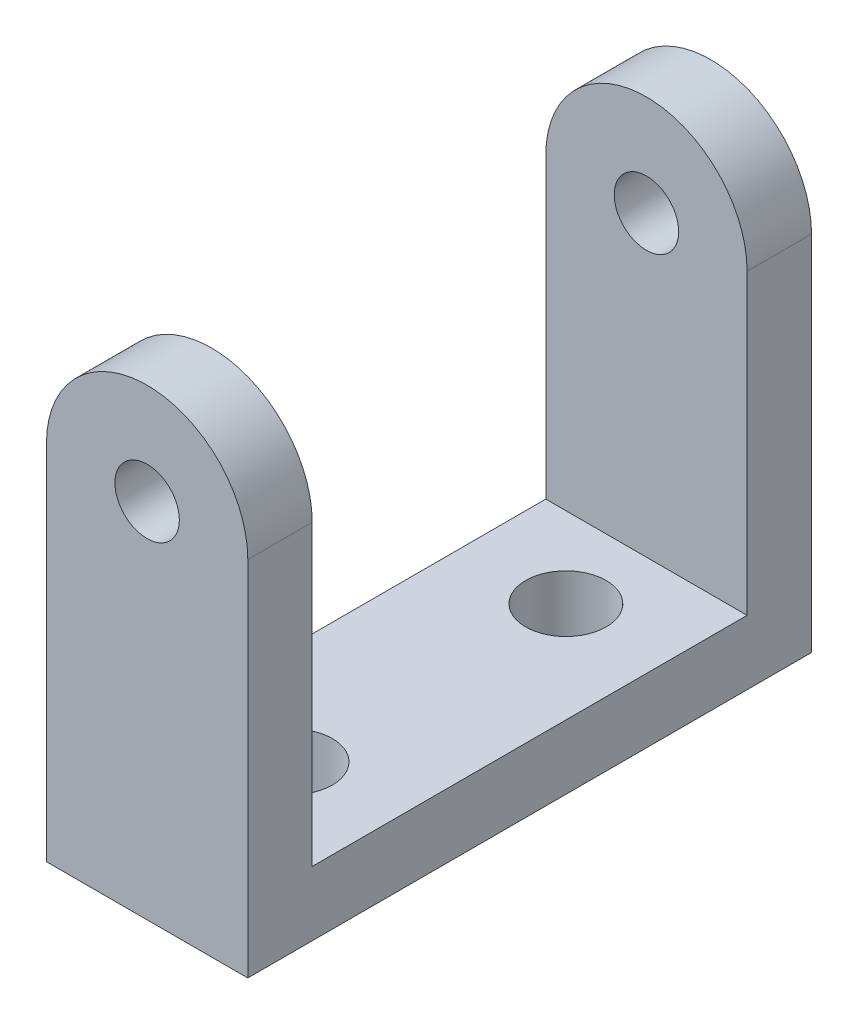
ISO-10303-21;
HEADER;
FILE_DESCRIPTION(('STEP AP214'),'2;1');
FILE_NAME('part.step','',(''),(''),'','','');
FILE_SCHEMA(('AUTOMOTIVE_DESIGN { 1 0 10303 214 1 1 1 1 }'));
ENDSEC;
DATA;
#1=APPLICATION_CONTEXT('core data for automotive mechanical design processes');
#2=APPLICATION_PROTOCOL_DEFINITION('international standard','automotive_design',2000,#1);
#3=PRODUCT_CONTEXT('',#1,'mechanical');
#4=PRODUCT('Part','Part','',(#3));
#5=PRODUCT_RELATED_PRODUCT_CATEGORY('part','',(#4));
#6=PRODUCT_DEFINITION_FORMATION('','',#4);
#7=PRODUCT_DEFINITION_CONTEXT('part definition',#1,'design');
#8=PRODUCT_DEFINITION('design','',#6,#7);
#9=PRODUCT_DEFINITION_SHAPE('','',#8);
#10=(LENGTH_UNIT() NAMED_UNIT(*) SI_UNIT(.MILLI.,.METRE.));
#11=(NAMED_UNIT(*) PLANE_ANGLE_UNIT() SI_UNIT($,.RADIAN.));
#12=(NAMED_UNIT(*) SI_UNIT($,.STERADIAN.) SOLID_ANGLE_UNIT());
#13=UNCERTAINTY_MEASURE_WITH_UNIT(LENGTH_MEASURE(1.E-05),#10,'distance_accuracy_value','');
#14=(GEOMETRIC_REPRESENTATION_CONTEXT(3) GLOBAL_UNCERTAINTY_ASSIGNED_CONTEXT((#13)) GLOBAL_UNIT_ASSIGNED_CONTEXT((#10,
#11,#12)) REPRESENTATION_CONTEXT('',''));
#15=CARTESIAN_POINT('',(0.,0.,0.));
#16=DIRECTION('',(0.,0.,1.));
#17=DIRECTION('',(1.,0.,0.));
#18=AXIS2_PLACEMENT_3D('',#15,#16,#17);
#19=CARTESIAN_POINT('',(0.,45.,70.));
#20=DIRECTION('',(0.,0.,-1.));
#21=DIRECTION('',(-1.,0.,0.));
#22=AXIS2_PLACEMENT_3D('',#19,#20,#21);
#23=CYLINDRICAL_SURFACE('',#22,12.5);
#24=DIRECTION('',(0.,0.,-1.));
#25=VECTOR('',#24,1.);
#26=CARTESIAN_POINT('',(12.5,45.,70.));
#27=LINE('',#26,#25);
#28=CARTESIAN_POINT('',(12.5,45.,70.));
#29=VERTEX_POINT('',#28);
#30=CARTESIAN_POINT('',(12.5,45.,62.));
#31=VERTEX_POINT('',#30);
#32=EDGE_CURVE('E11',#29,#31,#27,.T.);
#33=ORIENTED_EDGE('',*,*,#32,.T.);
#34=CARTESIAN_POINT('',(0.,45.,62.));
#35=DIRECTION('',(0.,0.,1.));
#36=DIRECTION('',(0.,-1.,0.));
#37=AXIS2_PLACEMENT_3D('',#34,#35,#36);
#38=CIRCLE('',#37,12.5);
#39=CARTESIAN_POINT('',(-12.5,45.,62.));
#40=VERTEX_POINT('',#39);
#41=EDGE_CURVE('E119',#31,#40,#38,.T.);
#42=ORIENTED_EDGE('',*,*,#41,.T.);
#43=DIRECTION('',(0.,0.,-1.));
#44=VECTOR('',#43,1.);
#45=CARTESIAN_POINT('',(-12.5,45.,70.));
#46=LINE('',#45,#44);
#47=CARTESIAN_POINT('',(-12.5,45.,70.));
#48=VERTEX_POINT('',#47);
#49=EDGE_CURVE('E177',#48,#40,#46,.T.);
#50=ORIENTED_EDGE('',*,*,#49,.F.);
#51=CARTESIAN_POINT('',(0.,45.,70.));
#52=DIRECTION('',(0.,0.,1.));
#53=DIRECTION('',(1.,0.,0.));
#54=AXIS2_PLACEMENT_3D('',#51,#52,#53);
#55=CIRCLE('',#54,12.5);
#56=EDGE_CURVE('E92',#29,#48,#55,.T.);
#57=ORIENTED_EDGE('',*,*,#56,.F.);
#58=EDGE_LOOP('',(#33,#42,#50,#57));
#59=FACE_BOUND('',#58,.T.);
#60=ADVANCED_FACE('F38',(#59),#23,.T.);
#61=CARTESIAN_POINT('',(0.,45.,70.));
#62=DIRECTION('',(0.,0.,-1.));
#63=DIRECTION('',(-1.,0.,0.));
#64=AXIS2_PLACEMENT_3D('',#61,#62,#63);
#65=CYLINDRICAL_SURFACE('',#64,4.);
#66=CARTESIAN_POINT('',(0.,45.,62.));
#67=DIRECTION('',(0.,0.,1.));
#68=DIRECTION('',(0.,-1.,0.));
#69=AXIS2_PLACEMENT_3D('',#66,#67,#68);
#70=CIRCLE('',#69,4.);
#71=CARTESIAN_POINT('',(0.,41.,62.));
#72=VERTEX_POINT('',#71);
#73=EDGE_CURVE('E149',#72,#72,#70,.T.);
#74=ORIENTED_EDGE('',*,*,#73,.F.);
#75=EDGE_LOOP('',(#74));
#76=FACE_BOUND('',#75,.T.);
#77=CARTESIAN_POINT('',(0.,45.,70.));
#78=DIRECTION('',(0.,0.,1.));
#79=DIRECTION('',(1.,0.,0.));
#80=AXIS2_PLACEMENT_3D('',#77,#78,#79);
#81=CIRCLE('',#80,4.);
#82=CARTESIAN_POINT('',(4.,45.,70.));
#83=VERTEX_POINT('',#82);
#84=EDGE_CURVE('E152',#83,#83,#81,.T.);
#85=ORIENTED_EDGE('',*,*,#84,.T.);
#86=EDGE_LOOP('',(#85));
#87=FACE_BOUND('',#86,.T.);
#88=ADVANCED_FACE('F212',(#76,#87),#65,.F.);
#89=CARTESIAN_POINT('',(0.,45.,70.));
#90=DIRECTION('',(0.,0.,1.));
#91=DIRECTION('',(1.,0.,0.));
#92=AXIS2_PLACEMENT_3D('',#89,#90,#91);
#93=PLANE('',#92);
#94=DIRECTION('',(0.,1.,0.));
#95=VECTOR('',#94,1.);
#96=CARTESIAN_POINT('',(12.5,0.,70.));
#97=LINE('',#96,#95);
#98=CARTESIAN_POINT('',(12.5,0.,70.));
#99=VERTEX_POINT('',#98);
#100=EDGE_CURVE('E158',#99,#29,#97,.T.);
#101=ORIENTED_EDGE('',*,*,#100,.T.);
#102=ORIENTED_EDGE('',*,*,#56,.T.);
#103=DIRECTION('',(0.,-1.,0.));
#104=VECTOR('',#103,1.);
#105=CARTESIAN_POINT('',(-12.5,0.,70.));
#106=LINE('',#105,#104);
#107=CARTESIAN_POINT('',(-12.5,0.,70.));
#108=VERTEX_POINT('',#107);
#109=EDGE_CURVE('E161',#48,#108,#106,.T.);
#110=ORIENTED_EDGE('',*,*,#109,.T.);
#111=DIRECTION('',(1.,0.,0.));
#112=VECTOR('',#111,1.);
#113=CARTESIAN_POINT('',(-12.5,0.,70.));
#114=LINE('',#113,#112);
#115=EDGE_CURVE('E64',#108,#99,#114,.T.);
#116=ORIENTED_EDGE('',*,*,#115,.T.);
#117=EDGE_LOOP('',(#101,#102,#110,#116));
#118=FACE_BOUND('',#117,.T.);
#119=ORIENTED_EDGE('',*,*,#84,.F.);
#120=EDGE_LOOP('',(#119));
#121=FACE_BOUND('',#120,.T.);
#122=ADVANCED_FACE('F221',(#118,#121),#93,.T.);
#123=CARTESIAN_POINT('',(0.,45.,0.));
#124=DIRECTION('',(0.,0.,1.));
#125=DIRECTION('',(1.,0.,0.));
#126=AXIS2_PLACEMENT_3D('',#123,#124,#125);
#127=PLANE('',#126);
#128=DIRECTION('',(0.,1.,0.));
#129=VECTOR('',#128,1.);
#130=CARTESIAN_POINT('',(12.5,0.,0.));
#131=LINE('',#130,#129);
#132=CARTESIAN_POINT('',(12.5,0.,0.));
#133=VERTEX_POINT('',#132);
#134=CARTESIAN_POINT('',(12.5,45.,0.));
#135=VERTEX_POINT('',#134);
#136=EDGE_CURVE('E155',#133,#135,#131,.T.);
#137=ORIENTED_EDGE('',*,*,#136,.F.);
#138=DIRECTION('',(1.,0.,0.));
#139=VECTOR('',#138,1.);
#140=CARTESIAN_POINT('',(-12.5,0.,0.));
#141=LINE('',#140,#139);
#142=CARTESIAN_POINT('',(-12.5,0.,0.));
#143=VERTEX_POINT('',#142);
#144=EDGE_CURVE('E85',#143,#133,#141,.T.);
#145=ORIENTED_EDGE('',*,*,#144,.F.);
#146=DIRECTION('',(0.,-1.,0.));
#147=VECTOR('',#146,1.);
#148=CARTESIAN_POINT('',(-12.5,0.,0.));
#149=LINE('',#148,#147);
#150=CARTESIAN_POINT('',(-12.5,45.,0.));
#151=VERTEX_POINT('',#150);
#152=EDGE_CURVE('E170',#151,#143,#149,.T.);
#153=ORIENTED_EDGE('',*,*,#152,.F.);
#154=CARTESIAN_POINT('',(0.,45.,0.));
#155=DIRECTION('',(0.,0.,1.));
#156=DIRECTION('',(1.,0.,0.));
#157=AXIS2_PLACEMENT_3D('',#154,#155,#156);
#158=CIRCLE('',#157,12.5);
#159=EDGE_CURVE('E167',#135,#151,#158,.T.);
#160=ORIENTED_EDGE('',*,*,#159,.F.);
#161=EDGE_LOOP('',(#137,#145,#153,#160));
#162=FACE_BOUND('',#161,.T.);
#163=CARTESIAN_POINT('',(0.,45.,0.));
#164=DIRECTION('',(0.,0.,1.));
#165=DIRECTION('',(1.,0.,0.));
#166=AXIS2_PLACEMENT_3D('',#163,#164,#165);
#167=CIRCLE('',#166,4.);
#168=CARTESIAN_POINT('',(4.,45.,0.));
#169=VERTEX_POINT('',#168);
#170=EDGE_CURVE('E151',#169,#169,#167,.T.);
#171=ORIENTED_EDGE('',*,*,#170,.T.);
#172=EDGE_LOOP('',(#171));
#173=FACE_BOUND('',#172,.T.);
#174=ADVANCED_FACE('F228',(#162,#173),#127,.F.);
#175=CARTESIAN_POINT('',(12.5,0.,70.));
#176=DIRECTION('',(-1.,0.,0.));
#177=DIRECTION('',(0.,-1.,0.));
#178=AXIS2_PLACEMENT_3D('',#175,#176,#177);
#179=PLANE('',#178);
#180=DIRECTION('',(0.,0.,-1.));
#181=VECTOR('',#180,1.);
#182=CARTESIAN_POINT('',(12.5,8.00000000000001,62.));
#183=LINE('',#182,#181);
#184=CARTESIAN_POINT('',(12.5,8.00000000000001,62.));
#185=VERTEX_POINT('',#184);
#186=CARTESIAN_POINT('',(12.5,8.00000000000003,7.99999999999997));
#187=VERTEX_POINT('',#186);
#188=EDGE_CURVE('E123',#185,#187,#183,.T.);
#189=ORIENTED_EDGE('',*,*,#188,.F.);
#190=DIRECTION('',(0.,-1.,0.));
#191=VECTOR('',#190,1.);
#192=CARTESIAN_POINT('',(12.5,57.5,62.));
#193=LINE('',#192,#191);
#194=EDGE_CURVE('E113',#31,#185,#193,.T.);
#195=ORIENTED_EDGE('',*,*,#194,.F.);
#196=ORIENTED_EDGE('',*,*,#32,.F.);
#197=ORIENTED_EDGE('',*,*,#100,.F.);
#198=DIRECTION('',(0.,0.,-1.));
#199=VECTOR('',#198,1.);
#200=CARTESIAN_POINT('',(12.5,0.,70.));
#201=LINE('',#200,#199);
#202=EDGE_CURVE('E164',#99,#133,#201,.T.);
#203=ORIENTED_EDGE('',*,*,#202,.T.);
#204=ORIENTED_EDGE('',*,*,#136,.T.);
#205=CARTESIAN_POINT('',(12.5,45.,7.99999999999999));
#206=VERTEX_POINT('',#205);
#207=EDGE_CURVE('E47',#206,#135,#27,.T.);
#208=ORIENTED_EDGE('',*,*,#207,.F.);
#209=DIRECTION('',(0.,1.,0.));
#210=VECTOR('',#209,1.);
#211=CARTESIAN_POINT('',(12.5,57.5,8.));
#212=LINE('',#211,#210);
#213=EDGE_CURVE('E136',#187,#206,#212,.T.);
#214=ORIENTED_EDGE('',*,*,#213,.F.);
#215=EDGE_LOOP('',(#189,#195,#196,#197,#203,#204,#208,#214));
#216=FACE_BOUND('',#215,.T.);
#217=ADVANCED_FACE('F40',(#216),#179,.F.);
#218=CARTESIAN_POINT('',(0.,45.,7.99999999999999));
#219=DIRECTION('',(0.,0.,-1.));
#220=DIRECTION('',(0.,1.,0.));
#221=AXIS2_PLACEMENT_3D('',#218,#219,#220);
#222=CIRCLE('',#221,12.5);
#223=CARTESIAN_POINT('',(-12.5,45.,7.99999999999999));
#224=VERTEX_POINT('',#223);
#225=EDGE_CURVE('E147',#224,#206,#222,.T.);
#226=ORIENTED_EDGE('',*,*,#225,.T.);
#227=ORIENTED_EDGE('',*,*,#207,.T.);
#228=ORIENTED_EDGE('',*,*,#159,.T.);
#229=EDGE_CURVE('E176',#224,#151,#46,.T.);
#230=ORIENTED_EDGE('',*,*,#229,.F.);
#231=EDGE_LOOP('',(#226,#227,#228,#230));
#232=FACE_BOUND('',#231,.T.);
#233=ADVANCED_FACE('F213',(#232),#23,.T.);
#234=CARTESIAN_POINT('',(-12.5,0.,70.));
#235=DIRECTION('',(1.,0.,0.));
#236=DIRECTION('',(0.,0.,-1.));
#237=AXIS2_PLACEMENT_3D('',#234,#235,#236);
#238=PLANE('',#237);
#239=ORIENTED_EDGE('',*,*,#49,.T.);
#240=DIRECTION('',(0.,-1.,0.));
#241=VECTOR('',#240,1.);
#242=CARTESIAN_POINT('',(-12.5,57.5,62.));
#243=LINE('',#242,#241);
#244=CARTESIAN_POINT('',(-12.5,8.00000000000001,62.));
#245=VERTEX_POINT('',#244);
#246=EDGE_CURVE('E138',#40,#245,#243,.T.);
#247=ORIENTED_EDGE('',*,*,#246,.T.);
#248=DIRECTION('',(0.,0.,-1.));
#249=VECTOR('',#248,1.);
#250=CARTESIAN_POINT('',(-12.5,8.00000000000001,62.));
#251=LINE('',#250,#249);
#252=CARTESIAN_POINT('',(-12.5,8.00000000000003,7.99999999999997));
#253=VERTEX_POINT('',#252);
#254=EDGE_CURVE('E130',#245,#253,#251,.T.);
#255=ORIENTED_EDGE('',*,*,#254,.T.);
#256=DIRECTION('',(0.,1.,0.));
#257=VECTOR('',#256,1.);
#258=CARTESIAN_POINT('',(-12.5,57.5,8.));
#259=LINE('',#258,#257);
#260=EDGE_CURVE('E55',#253,#224,#259,.T.);
#261=ORIENTED_EDGE('',*,*,#260,.T.);
#262=ORIENTED_EDGE('',*,*,#229,.T.);
#263=ORIENTED_EDGE('',*,*,#152,.T.);
#264=DIRECTION('',(0.,0.,-1.));
#265=VECTOR('',#264,1.);
#266=CARTESIAN_POINT('',(-12.5,0.,70.));
#267=LINE('',#266,#265);
#268=EDGE_CURVE('E174',#108,#143,#267,.T.);
#269=ORIENTED_EDGE('',*,*,#268,.F.);
#270=ORIENTED_EDGE('',*,*,#109,.F.);
#271=EDGE_LOOP('',(#239,#247,#255,#261,#262,#263,#269,#270));
#272=FACE_BOUND('',#271,.T.);
#273=ADVANCED_FACE('F203',(#272),#238,.F.);
#274=CARTESIAN_POINT('',(-12.5,0.,70.));
#275=DIRECTION('',(0.,1.,0.));
#276=DIRECTION('',(-1.,0.,0.));
#277=AXIS2_PLACEMENT_3D('',#274,#275,#276);
#278=PLANE('',#277);
#279=CARTESIAN_POINT('',(0.,0.,18.));
#280=DIRECTION('',(0.,-1.,0.));
#281=DIRECTION('',(1.,0.,0.));
#282=AXIS2_PLACEMENT_3D('',#279,#280,#281);
#283=CIRCLE('',#282,5.);
#284=CARTESIAN_POINT('',(5.,0.,18.));
#285=VERTEX_POINT('',#284);
#286=EDGE_CURVE('E185',#285,#285,#283,.T.);
#287=ORIENTED_EDGE('',*,*,#286,.F.);
#288=EDGE_LOOP('',(#287));
#289=FACE_BOUND('',#288,.T.);
#290=CARTESIAN_POINT('',(0.,0.,52.));
#291=DIRECTION('',(0.,-1.,0.));
#292=DIRECTION('',(1.,0.,0.));
#293=AXIS2_PLACEMENT_3D('',#290,#291,#292);
#294=CIRCLE('',#293,5.);
#295=CARTESIAN_POINT('',(5.,0.,52.));
#296=VERTEX_POINT('',#295);
#297=EDGE_CURVE('E190',#296,#296,#294,.T.);
#298=ORIENTED_EDGE('',*,*,#297,.F.);
#299=EDGE_LOOP('',(#298));
#300=FACE_BOUND('',#299,.T.);
#301=ORIENTED_EDGE('',*,*,#144,.T.);
#302=ORIENTED_EDGE('',*,*,#202,.F.);
#303=ORIENTED_EDGE('',*,*,#115,.F.);
#304=ORIENTED_EDGE('',*,*,#268,.T.);
#305=EDGE_LOOP('',(#301,#302,#303,#304));
#306=FACE_BOUND('',#305,.T.);
#307=ADVANCED_FACE('F200',(#289,#300,#306),#278,.F.);
#308=CARTESIAN_POINT('',(0.,45.,7.99999999999999));
#309=DIRECTION('',(0.,0.,-1.));
#310=DIRECTION('',(0.,1.,0.));
#311=AXIS2_PLACEMENT_3D('',#308,#309,#310);
#312=CIRCLE('',#311,4.);
#313=CARTESIAN_POINT('',(0.,49.,7.99999999999999));
#314=VERTEX_POINT('',#313);
#315=EDGE_CURVE('E145',#314,#314,#312,.T.);
#316=ORIENTED_EDGE('',*,*,#315,.F.);
#317=EDGE_LOOP('',(#316));
#318=FACE_BOUND('',#317,.T.);
#319=ORIENTED_EDGE('',*,*,#170,.F.);
#320=EDGE_LOOP('',(#319));
#321=FACE_BOUND('',#320,.T.);
#322=ADVANCED_FACE('F202',(#318,#321),#65,.F.);
#323=CARTESIAN_POINT('',(-12.5,57.5,62.));
#324=DIRECTION('',(0.,0.,1.));
#325=DIRECTION('',(0.,-1.,0.));
#326=AXIS2_PLACEMENT_3D('',#323,#324,#325);
#327=PLANE('',#326);
#328=ORIENTED_EDGE('',*,*,#73,.T.);
#329=EDGE_LOOP('',(#328));
#330=FACE_BOUND('',#329,.T.);
#331=ORIENTED_EDGE('',*,*,#194,.T.);
#332=DIRECTION('',(1.,0.,0.));
#333=VECTOR('',#332,1.);
#334=CARTESIAN_POINT('',(-12.5,8.00000000000001,62.));
#335=LINE('',#334,#333);
#336=EDGE_CURVE('E117',#245,#185,#335,.T.);
#337=ORIENTED_EDGE('',*,*,#336,.F.);
#338=ORIENTED_EDGE('',*,*,#246,.F.);
#339=ORIENTED_EDGE('',*,*,#41,.F.);
#340=EDGE_LOOP('',(#331,#337,#338,#339));
#341=FACE_BOUND('',#340,.T.);
#342=ADVANCED_FACE('F115',(#330,#341),#327,.F.);
#343=CARTESIAN_POINT('',(-12.5,57.5,8.));
#344=DIRECTION('',(0.,0.,-1.));
#345=DIRECTION('',(0.,1.,0.));
#346=AXIS2_PLACEMENT_3D('',#343,#344,#345);
#347=PLANE('',#346);
#348=ORIENTED_EDGE('',*,*,#315,.T.);
#349=EDGE_LOOP('',(#348));
#350=FACE_BOUND('',#349,.T.);
#351=ORIENTED_EDGE('',*,*,#225,.F.);
#352=ORIENTED_EDGE('',*,*,#260,.F.);
#353=DIRECTION('',(1.,0.,0.));
#354=VECTOR('',#353,1.);
#355=CARTESIAN_POINT('',(-12.5,8.00000000000003,7.99999999999997));
#356=LINE('',#355,#354);
#357=EDGE_CURVE('E132',#253,#187,#356,.T.);
#358=ORIENTED_EDGE('',*,*,#357,.T.);
#359=ORIENTED_EDGE('',*,*,#213,.T.);
#360=EDGE_LOOP('',(#351,#352,#358,#359));
#361=FACE_BOUND('',#360,.T.);
#362=ADVANCED_FACE('F231',(#350,#361),#347,.F.);
#363=CARTESIAN_POINT('',(-12.5,8.00000000000001,62.));
#364=DIRECTION('',(0.,-1.,0.));
#365=DIRECTION('',(0.,0.,-1.));
#366=AXIS2_PLACEMENT_3D('',#363,#364,#365);
#367=PLANE('',#366);
#368=CARTESIAN_POINT('',(0.,8.00000000000002,18.));
#369=DIRECTION('',(0.,-1.,0.));
#370=DIRECTION('',(0.,0.,-1.));
#371=AXIS2_PLACEMENT_3D('',#368,#369,#370);
#372=CIRCLE('',#371,5.);
#373=CARTESIAN_POINT('',(5.,8.00000000000003,18.));
#374=VERTEX_POINT('',#373);
#375=EDGE_CURVE('E42',#374,#374,#372,.T.);
#376=ORIENTED_EDGE('',*,*,#375,.T.);
#377=EDGE_LOOP('',(#376));
#378=FACE_BOUND('',#377,.T.);
#379=CARTESIAN_POINT('',(0.,8.00000000000001,52.));
#380=DIRECTION('',(0.,-1.,0.));
#381=DIRECTION('',(0.,0.,-1.));
#382=AXIS2_PLACEMENT_3D('',#379,#380,#381);
#383=CIRCLE('',#382,5.);
#384=CARTESIAN_POINT('',(5.,8.00000000000001,52.));
#385=VERTEX_POINT('',#384);
#386=EDGE_CURVE('E183',#385,#385,#383,.T.);
#387=ORIENTED_EDGE('',*,*,#386,.T.);
#388=EDGE_LOOP('',(#387));
#389=FACE_BOUND('',#388,.T.);
#390=ORIENTED_EDGE('',*,*,#357,.F.);
#391=ORIENTED_EDGE('',*,*,#254,.F.);
#392=ORIENTED_EDGE('',*,*,#336,.T.);
#393=ORIENTED_EDGE('',*,*,#188,.T.);
#394=EDGE_LOOP('',(#390,#391,#392,#393));
#395=FACE_BOUND('',#394,.T.);
#396=ADVANCED_FACE('F127',(#378,#389,#395),#367,.F.);
#397=CARTESIAN_POINT('',(0.,57.5,52.));
#398=DIRECTION('',(0.,-1.,0.));
#399=DIRECTION('',(1.,0.,0.));
#400=AXIS2_PLACEMENT_3D('',#397,#398,#399);
#401=CYLINDRICAL_SURFACE('',#400,5.);
#402=CARTESIAN_POINT('',(5.,0.,52.));
#403=CARTESIAN_POINT('',(5.,0.0833333333333402,52.));
#404=CARTESIAN_POINT('',(5.,0.166666666666674,52.));
#405=CARTESIAN_POINT('',(5.,0.333333333333341,52.));
#406=CARTESIAN_POINT('',(5.,0.416666666666674,52.));
#407=CARTESIAN_POINT('',(5.,0.583333333333341,52.));
#408=CARTESIAN_POINT('',(5.,0.666666666666674,52.));
#409=CARTESIAN_POINT('',(5.,0.833333333333341,52.));
#410=CARTESIAN_POINT('',(5.,0.916666666666674,52.));
#411=CARTESIAN_POINT('',(5.,1.08333333333334,52.));
#412=CARTESIAN_POINT('',(5.,1.16666666666667,52.));
#413=CARTESIAN_POINT('',(5.,1.33333333333334,52.));
#414=CARTESIAN_POINT('',(5.,1.41666666666667,52.));
#415=CARTESIAN_POINT('',(5.,1.58333333333334,52.));
#416=CARTESIAN_POINT('',(5.,1.66666666666667,52.));
#417=CARTESIAN_POINT('',(5.,1.83333333333334,52.));
#418=CARTESIAN_POINT('',(5.,1.91666666666668,52.));
#419=CARTESIAN_POINT('',(5.,2.08333333333334,52.));
#420=CARTESIAN_POINT('',(5.,2.16666666666668,52.));
#421=CARTESIAN_POINT('',(5.,2.33333333333334,52.));
#422=CARTESIAN_POINT('',(5.,2.41666666666668,52.));
#423=CARTESIAN_POINT('',(5.,2.58333333333334,52.));
#424=CARTESIAN_POINT('',(5.,2.66666666666668,52.));
#425=CARTESIAN_POINT('',(5.,2.83333333333334,52.));
#426=CARTESIAN_POINT('',(5.,2.91666666666668,52.));
#427=CARTESIAN_POINT('',(5.,3.08333333333334,52.));
#428=CARTESIAN_POINT('',(5.,3.16666666666668,52.));
#429=CARTESIAN_POINT('',(5.,3.33333333333334,52.));
#430=CARTESIAN_POINT('',(5.,3.41666666666668,52.));
#431=CARTESIAN_POINT('',(5.,3.58333333333334,52.));
#432=CARTESIAN_POINT('',(5.,3.66666666666668,52.));
#433=CARTESIAN_POINT('',(5.,3.83333333333334,52.));
#434=CARTESIAN_POINT('',(5.,3.91666666666668,52.));
#435=CARTESIAN_POINT('',(5.,4.08333333333334,52.));
#436=CARTESIAN_POINT('',(5.,4.16666666666668,52.));
#437=CARTESIAN_POINT('',(5.,4.33333333333334,52.));
#438=CARTESIAN_POINT('',(5.,4.41666666666668,52.));
#439=CARTESIAN_POINT('',(5.,4.58333333333334,52.));
#440=CARTESIAN_POINT('',(5.,4.66666666666668,52.));
#441=CARTESIAN_POINT('',(5.,4.83333333333334,52.));
#442=CARTESIAN_POINT('',(5.,4.91666666666668,52.));
#443=CARTESIAN_POINT('',(5.,5.08333333333335,52.));
#444=CARTESIAN_POINT('',(5.,5.16666666666668,52.));
#445=CARTESIAN_POINT('',(5.,5.33333333333335,52.));
#446=CARTESIAN_POINT('',(5.,5.41666666666668,52.));
#447=CARTESIAN_POINT('',(5.,5.58333333333335,52.));
#448=CARTESIAN_POINT('',(5.,5.66666666666668,52.));
#449=CARTESIAN_POINT('',(5.,5.83333333333335,52.));
#450=CARTESIAN_POINT('',(5.,5.91666666666668,52.));
#451=CARTESIAN_POINT('',(5.,6.08333333333335,52.));
#452=CARTESIAN_POINT('',(5.,6.16666666666668,52.));
#453=CARTESIAN_POINT('',(5.,6.33333333333335,52.));
#454=CARTESIAN_POINT('',(5.,6.41666666666668,52.));
#455=CARTESIAN_POINT('',(5.,6.58333333333335,52.));
#456=CARTESIAN_POINT('',(5.,6.66666666666668,52.));
#457=CARTESIAN_POINT('',(5.,6.83333333333335,52.));
#458=CARTESIAN_POINT('',(5.,6.91666666666668,52.));
#459=CARTESIAN_POINT('',(5.,7.08333333333335,52.));
#460=CARTESIAN_POINT('',(5.,7.16666666666668,52.));
#461=CARTESIAN_POINT('',(5.,7.33333333333335,52.));
#462=CARTESIAN_POINT('',(5.,7.41666666666668,52.));
#463=CARTESIAN_POINT('',(5.,7.58333333333335,52.));
#464=CARTESIAN_POINT('',(5.,7.66666666666668,52.));
#465=CARTESIAN_POINT('',(5.,7.83333333333335,52.));
#466=CARTESIAN_POINT('',(5.,7.91666666666668,52.));
#467=CARTESIAN_POINT('',(5.,8.00000000000001,52.));
#468=B_SPLINE_CURVE_WITH_KNOTS('',3,(#402,#403,#404,#405,#406,#407,#408,#409,#410,#411,#412,
#413,#414,#415,#416,#417,#418,#419,#420,#421,#422,#423,#424,#425,#426,#427,#428,#429,#430,#431,
#432,#433,#434,#435,#436,#437,#438,#439,#440,#441,#442,#443,#444,#445,#446,#447,#448,#449,#450,
#451,#452,#453,#454,#455,#456,#457,#458,#459,#460,#461,#462,#463,#464,#465,#466,#467),
.UNSPECIFIED.,.F.,.F.,(4,2,2,2,2,2,2,2,2,2,2,2,2,2,2,2,2,2,2,2,2,2,2,2,2,2,2,2,2,2,2,2,4),(0.,
0.25,0.5,0.750000000000001,1.,1.25,1.5,1.75,2.,2.25,2.5,2.75,3.,3.25,3.5,3.75,4.,4.25,4.5,4.75,
5.,5.25,5.50000000000001,5.75000000000001,6.00000000000001,6.25000000000001,6.50000000000001,
6.75000000000001,7.00000000000001,7.25000000000001,7.50000000000001,7.75000000000001,
8.00000000000001),.UNSPECIFIED.);
#469=EDGE_CURVE('BSEAM197',#296,#385,#468,.T.);
#470=ORIENTED_EDGE('',*,*,#297,.T.);
#471=ORIENTED_EDGE('',*,*,#386,.F.);
#472=ORIENTED_EDGE('',*,*,#469,.T.);
#473=ORIENTED_EDGE('',*,*,#469,.F.);
#474=EDGE_LOOP('',(#470,#472,#471,#473));
#475=FACE_BOUND('',#474,.T.);
#476=ADVANCED_FACE('F197',(#475),#401,.F.);
#477=CARTESIAN_POINT('',(0.,57.5,18.));
#478=DIRECTION('',(0.,-1.,0.));
#479=DIRECTION('',(1.,0.,0.));
#480=AXIS2_PLACEMENT_3D('',#477,#478,#479);
#481=CYLINDRICAL_SURFACE('',#480,5.);
#482=CARTESIAN_POINT('',(5.,0.,18.));
#483=CARTESIAN_POINT('',(5.,0.0833333333333402,18.));
#484=CARTESIAN_POINT('',(5.,0.166666666666674,18.));
#485=CARTESIAN_POINT('',(5.,0.333333333333341,18.));
#486=CARTESIAN_POINT('',(5.,0.416666666666674,18.));
#487=CARTESIAN_POINT('',(5.,0.583333333333341,18.));
#488=CARTESIAN_POINT('',(5.,0.666666666666674,18.));
#489=CARTESIAN_POINT('',(5.,0.833333333333341,18.));
#490=CARTESIAN_POINT('',(5.,0.916666666666674,18.));
#491=CARTESIAN_POINT('',(5.,1.08333333333334,18.));
#492=CARTESIAN_POINT('',(5.,1.16666666666667,18.));
#493=CARTESIAN_POINT('',(5.,1.33333333333334,18.));
#494=CARTESIAN_POINT('',(5.,1.41666666666667,18.));
#495=CARTESIAN_POINT('',(5.,1.58333333333334,18.));
#496=CARTESIAN_POINT('',(5.,1.66666666666667,18.));
#497=CARTESIAN_POINT('',(5.,1.83333333333334,18.));
#498=CARTESIAN_POINT('',(5.,1.91666666666668,18.));
#499=CARTESIAN_POINT('',(5.,2.08333333333334,18.));
#500=CARTESIAN_POINT('',(5.,2.16666666666668,18.));
#501=CARTESIAN_POINT('',(5.,2.33333333333335,18.));
#502=CARTESIAN_POINT('',(5.,2.41666666666668,18.));
#503=CARTESIAN_POINT('',(5.,2.58333333333335,18.));
#504=CARTESIAN_POINT('',(5.,2.66666666666668,18.));
#505=CARTESIAN_POINT('',(5.,2.83333333333335,18.));
#506=CARTESIAN_POINT('',(5.,2.91666666666668,18.));
#507=CARTESIAN_POINT('',(5.,3.08333333333335,18.));
#508=CARTESIAN_POINT('',(5.,3.16666666666668,18.));
#509=CARTESIAN_POINT('',(5.,3.33333333333335,18.));
#510=CARTESIAN_POINT('',(5.,3.41666666666668,18.));
#511=CARTESIAN_POINT('',(5.,3.58333333333335,18.));
#512=CARTESIAN_POINT('',(5.,3.66666666666668,18.));
#513=CARTESIAN_POINT('',(5.,3.83333333333335,18.));
#514=CARTESIAN_POINT('',(5.,3.91666666666668,18.));
#515=CARTESIAN_POINT('',(5.,4.08333333333335,18.));
#516=CARTESIAN_POINT('',(5.,4.16666666666668,18.));
#517=CARTESIAN_POINT('',(5.,4.33333333333335,18.));
#518=CARTESIAN_POINT('',(5.,4.41666666666668,18.));
#519=CARTESIAN_POINT('',(5.,4.58333333333335,18.));
#520=CARTESIAN_POINT('',(5.,4.66666666666668,18.));
#521=CARTESIAN_POINT('',(5.,4.83333333333335,18.));
#522=CARTESIAN_POINT('',(5.,4.91666666666668,18.));
#523=CARTESIAN_POINT('',(5.,5.08333333333335,18.));
#524=CARTESIAN_POINT('',(5.,5.16666666666668,18.));
#525=CARTESIAN_POINT('',(5.,5.33333333333335,18.));
#526=CARTESIAN_POINT('',(5.,5.41666666666668,18.));
#527=CARTESIAN_POINT('',(5.,5.58333333333335,18.));
#528=CARTESIAN_POINT('',(5.,5.66666666666669,18.));
#529=CARTESIAN_POINT('',(5.,5.83333333333336,18.));
#530=CARTESIAN_POINT('',(5.,5.91666666666669,18.));
#531=CARTESIAN_POINT('',(5.,6.08333333333336,18.));
#532=CARTESIAN_POINT('',(5.,6.16666666666669,18.));
#533=CARTESIAN_POINT('',(5.,6.33333333333336,18.));
#534=CARTESIAN_POINT('',(5.,6.41666666666669,18.));
#535=CARTESIAN_POINT('',(5.,6.58333333333336,18.));
#536=CARTESIAN_POINT('',(5.,6.66666666666669,18.));
#537=CARTESIAN_POINT('',(5.,6.83333333333336,18.));
#538=CARTESIAN_POINT('',(5.,6.91666666666669,18.));
#539=CARTESIAN_POINT('',(5.,7.08333333333336,18.));
#540=CARTESIAN_POINT('',(5.,7.16666666666669,18.));
#541=CARTESIAN_POINT('',(5.,7.33333333333336,18.));
#542=CARTESIAN_POINT('',(5.,7.41666666666669,18.));
#543=CARTESIAN_POINT('',(5.,7.58333333333336,18.));
#544=CARTESIAN_POINT('',(5.,7.66666666666669,18.));
#545=CARTESIAN_POINT('',(5.,7.83333333333336,18.));
#546=CARTESIAN_POINT('',(5.,7.9166666666667,18.));
#547=CARTESIAN_POINT('',(5.,8.00000000000003,18.));
#548=B_SPLINE_CURVE_WITH_KNOTS('',3,(#482,#483,#484,#485,#486,#487,#488,#489,#490,#491,#492,
#493,#494,#495,#496,#497,#498,#499,#500,#501,#502,#503,#504,#505,#506,#507,#508,#509,#510,#511,
#512,#513,#514,#515,#516,#517,#518,#519,#520,#521,#522,#523,#524,#525,#526,#527,#528,#529,#530,
#531,#532,#533,#534,#535,#536,#537,#538,#539,#540,#541,#542,#543,#544,#545,#546,#547),
.UNSPECIFIED.,.F.,.F.,(4,2,2,2,2,2,2,2,2,2,2,2,2,2,2,2,2,2,2,2,2,2,2,2,2,2,2,2,2,2,2,2,4),(0.,
0.25,0.5,0.750000000000001,1.,1.25,1.5,1.75,2.,2.25000000000001,2.50000000000001,
2.75000000000001,3.00000000000001,3.25000000000001,3.50000000000001,3.75000000000001,
4.00000000000001,4.25000000000001,4.50000000000001,4.75000000000001,5.00000000000001,
5.25000000000001,5.50000000000001,5.75000000000002,6.00000000000002,6.25000000000002,
6.50000000000002,6.75000000000002,7.00000000000002,7.25000000000002,7.50000000000002,
7.75000000000002,8.00000000000002),.UNSPECIFIED.);
#549=EDGE_CURVE('BSEAM259',#285,#374,#548,.T.);
#550=ORIENTED_EDGE('',*,*,#286,.T.);
#551=ORIENTED_EDGE('',*,*,#375,.F.);
#552=ORIENTED_EDGE('',*,*,#549,.T.);
#553=ORIENTED_EDGE('',*,*,#549,.F.);
#554=EDGE_LOOP('',(#550,#552,#551,#553));
#555=FACE_BOUND('',#554,.T.);
#556=ADVANCED_FACE('F259',(#555),#481,.F.);
#557=CLOSED_SHELL('',(#60,#88,#122,#174,#217,#233,#273,#307,#322,#342,#362,#396,#476,#556));
#558=MANIFOLD_SOLID_BREP('B2',#557);
#559=ADVANCED_BREP_SHAPE_REPRESENTATION('',(#18,#558),#14);
#560=SHAPE_DEFINITION_REPRESENTATION(#9,#559);
ENDSEC;
END-ISO-10303-21;
